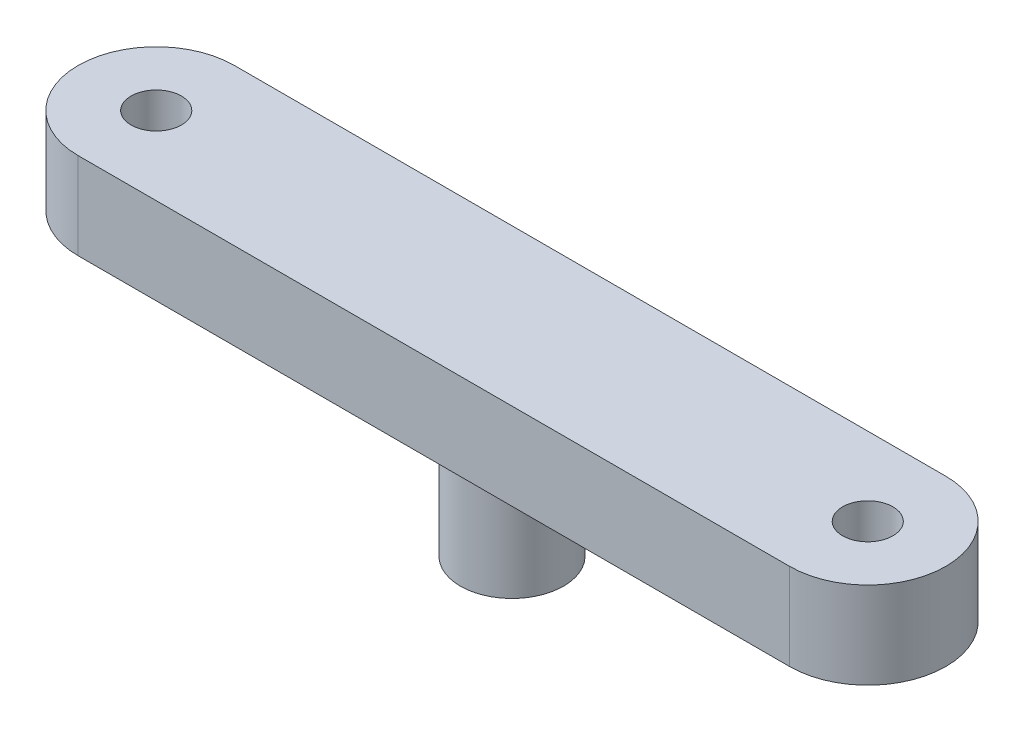
ISO-10303-21;
HEADER;
FILE_DESCRIPTION(('STEP AP214'),'2;1');
FILE_NAME('part.step','',(''),(''),'','','');
FILE_SCHEMA(('AUTOMOTIVE_DESIGN { 1 0 10303 214 1 1 1 1 }'));
ENDSEC;
DATA;
#1=APPLICATION_CONTEXT('core data for automotive mechanical design processes');
#2=APPLICATION_PROTOCOL_DEFINITION('international standard','automotive_design',2000,#1);
#3=PRODUCT_CONTEXT('',#1,'mechanical');
#4=PRODUCT('Part','Part','',(#3));
#5=PRODUCT_RELATED_PRODUCT_CATEGORY('part','',(#4));
#6=PRODUCT_DEFINITION_FORMATION('','',#4);
#7=PRODUCT_DEFINITION_CONTEXT('part definition',#1,'design');
#8=PRODUCT_DEFINITION('design','',#6,#7);
#9=PRODUCT_DEFINITION_SHAPE('','',#8);
#10=(LENGTH_UNIT() NAMED_UNIT(*) SI_UNIT(.MILLI.,.METRE.));
#11=(NAMED_UNIT(*) PLANE_ANGLE_UNIT() SI_UNIT($,.RADIAN.));
#12=(NAMED_UNIT(*) SI_UNIT($,.STERADIAN.) SOLID_ANGLE_UNIT());
#13=UNCERTAINTY_MEASURE_WITH_UNIT(LENGTH_MEASURE(1.E-05),#10,'distance_accuracy_value','');
#14=(GEOMETRIC_REPRESENTATION_CONTEXT(3) GLOBAL_UNCERTAINTY_ASSIGNED_CONTEXT((#13)) GLOBAL_UNIT_ASSIGNED_CONTEXT((#10,
#11,#12)) REPRESENTATION_CONTEXT('',''));
#15=CARTESIAN_POINT('',(0.,0.,0.));
#16=DIRECTION('',(0.,0.,1.));
#17=DIRECTION('',(1.,0.,0.));
#18=AXIS2_PLACEMENT_3D('',#15,#16,#17);
#19=CARTESIAN_POINT('',(-20.5,-27.5,485.5));
#20=DIRECTION('',(0.,0.,1.));
#21=DIRECTION('',(1.,0.,0.));
#22=AXIS2_PLACEMENT_3D('',#19,#20,#21);
#23=PLANE('',#22);
#24=DIRECTION('',(-1.,0.,0.));
#25=VECTOR('',#24,1.);
#26=CARTESIAN_POINT('',(-20.5,-32.5,485.5));
#27=LINE('',#26,#25);
#28=CARTESIAN_POINT('',(20.5,-32.5,485.5));
#29=VERTEX_POINT('',#28);
#30=CARTESIAN_POINT('',(-20.5,-32.5,485.5));
#31=VERTEX_POINT('',#30);
#32=EDGE_CURVE('E69',#29,#31,#27,.T.);
#33=ORIENTED_EDGE('',*,*,#32,.T.);
#34=DIRECTION('',(0.,-1.,0.));
#35=VECTOR('',#34,1.);
#36=CARTESIAN_POINT('',(-20.5,-27.5,485.5));
#37=LINE('',#36,#35);
#38=CARTESIAN_POINT('',(-20.5,-27.5,485.5));
#39=VERTEX_POINT('',#38);
#40=EDGE_CURVE('E48',#39,#31,#37,.T.);
#41=ORIENTED_EDGE('',*,*,#40,.F.);
#42=DIRECTION('',(-1.,0.,0.));
#43=VECTOR('',#42,1.);
#44=CARTESIAN_POINT('',(-20.5,-27.5,485.5));
#45=LINE('',#44,#43);
#46=CARTESIAN_POINT('',(20.5,-27.5,485.5));
#47=VERTEX_POINT('',#46);
#48=EDGE_CURVE('E94',#47,#39,#45,.T.);
#49=ORIENTED_EDGE('',*,*,#48,.F.);
#50=DIRECTION('',(0.,-1.,0.));
#51=VECTOR('',#50,1.);
#52=CARTESIAN_POINT('',(20.5,-27.5,485.5));
#53=LINE('',#52,#51);
#54=EDGE_CURVE('E11',#47,#29,#53,.T.);
#55=ORIENTED_EDGE('',*,*,#54,.T.);
#56=EDGE_LOOP('',(#33,#41,#49,#55));
#57=FACE_BOUND('',#56,.T.);
#58=ADVANCED_FACE('F39',(#57),#23,.F.);
#59=CARTESIAN_POINT('',(-20.5,-27.5,494.5));
#60=DIRECTION('',(0.,0.,-1.));
#61=DIRECTION('',(-1.,0.,0.));
#62=AXIS2_PLACEMENT_3D('',#59,#60,#61);
#63=PLANE('',#62);
#64=DIRECTION('',(1.,0.,0.));
#65=VECTOR('',#64,1.);
#66=CARTESIAN_POINT('',(-20.5,-32.5,494.5));
#67=LINE('',#66,#65);
#68=CARTESIAN_POINT('',(-20.5,-32.5,494.5));
#69=VERTEX_POINT('',#68);
#70=CARTESIAN_POINT('',(20.5,-32.5,494.5));
#71=VERTEX_POINT('',#70);
#72=EDGE_CURVE('E87',#69,#71,#67,.T.);
#73=ORIENTED_EDGE('',*,*,#72,.T.);
#74=DIRECTION('',(0.,-1.,0.));
#75=VECTOR('',#74,1.);
#76=CARTESIAN_POINT('',(20.5,-27.5,494.5));
#77=LINE('',#76,#75);
#78=CARTESIAN_POINT('',(20.5,-27.5,494.5));
#79=VERTEX_POINT('',#78);
#80=EDGE_CURVE('E89',#79,#71,#77,.T.);
#81=ORIENTED_EDGE('',*,*,#80,.F.);
#82=DIRECTION('',(1.,0.,0.));
#83=VECTOR('',#82,1.);
#84=CARTESIAN_POINT('',(-20.5,-27.5,494.5));
#85=LINE('',#84,#83);
#86=CARTESIAN_POINT('',(-20.5,-27.5,494.5));
#87=VERTEX_POINT('',#86);
#88=EDGE_CURVE('E60',#87,#79,#85,.T.);
#89=ORIENTED_EDGE('',*,*,#88,.F.);
#90=DIRECTION('',(0.,-1.,0.));
#91=VECTOR('',#90,1.);
#92=CARTESIAN_POINT('',(-20.5,-27.5,494.5));
#93=LINE('',#92,#91);
#94=EDGE_CURVE('E93',#87,#69,#93,.T.);
#95=ORIENTED_EDGE('',*,*,#94,.T.);
#96=EDGE_LOOP('',(#73,#81,#89,#95));
#97=FACE_BOUND('',#96,.T.);
#98=ADVANCED_FACE('F88',(#97),#63,.F.);
#99=CARTESIAN_POINT('',(0.,-27.5,0.));
#100=DIRECTION('',(0.,-1.,0.));
#101=DIRECTION('',(0.,0.,-1.));
#102=AXIS2_PLACEMENT_3D('',#99,#100,#101);
#103=PLANE('',#102);
#104=CARTESIAN_POINT('',(-20.5,-27.5,490.));
#105=DIRECTION('',(0.,1.,0.));
#106=DIRECTION('',(0.,0.,1.));
#107=AXIS2_PLACEMENT_3D('',#104,#105,#106);
#108=CIRCLE('',#107,1.45);
#109=CARTESIAN_POINT('',(-20.5,-27.5,491.45));
#110=VERTEX_POINT('',#109);
#111=EDGE_CURVE('E138',#110,#110,#108,.T.);
#112=ORIENTED_EDGE('',*,*,#111,.F.);
#113=EDGE_LOOP('',(#112));
#114=FACE_BOUND('',#113,.T.);
#115=CARTESIAN_POINT('',(20.5,-27.5,490.));
#116=DIRECTION('',(0.,1.,0.));
#117=DIRECTION('',(0.,0.,1.));
#118=AXIS2_PLACEMENT_3D('',#115,#116,#117);
#119=CIRCLE('',#118,1.45);
#120=CARTESIAN_POINT('',(20.5,-27.5,491.45));
#121=VERTEX_POINT('',#120);
#122=EDGE_CURVE('E122',#121,#121,#119,.T.);
#123=ORIENTED_EDGE('',*,*,#122,.F.);
#124=EDGE_LOOP('',(#123));
#125=FACE_BOUND('',#124,.T.);
#126=ORIENTED_EDGE('',*,*,#48,.T.);
#127=CARTESIAN_POINT('',(-20.5,-27.5,490.));
#128=DIRECTION('',(0.,1.,0.));
#129=DIRECTION('',(0.,0.,1.));
#130=AXIS2_PLACEMENT_3D('',#127,#128,#129);
#131=CIRCLE('',#130,4.5);
#132=EDGE_CURVE('E104',#39,#87,#131,.T.);
#133=ORIENTED_EDGE('',*,*,#132,.T.);
#134=ORIENTED_EDGE('',*,*,#88,.T.);
#135=CARTESIAN_POINT('',(20.5,-27.5,490.));
#136=DIRECTION('',(0.,1.,0.));
#137=DIRECTION('',(0.,0.,1.));
#138=AXIS2_PLACEMENT_3D('',#135,#136,#137);
#139=CIRCLE('',#138,4.5);
#140=EDGE_CURVE('E100',#79,#47,#139,.T.);
#141=ORIENTED_EDGE('',*,*,#140,.T.);
#142=EDGE_LOOP('',(#126,#133,#134,#141));
#143=FACE_BOUND('',#142,.T.);
#144=ADVANCED_FACE('F143',(#114,#125,#143),#103,.F.);
#145=CARTESIAN_POINT('',(0.,-32.5,0.));
#146=DIRECTION('',(0.,-1.,0.));
#147=DIRECTION('',(0.,0.,-1.));
#148=AXIS2_PLACEMENT_3D('',#145,#146,#147);
#149=PLANE('',#148);
#150=CARTESIAN_POINT('',(-20.5,-32.5,490.));
#151=DIRECTION('',(0.,1.,0.));
#152=DIRECTION('',(0.,0.,1.));
#153=AXIS2_PLACEMENT_3D('',#150,#151,#152);
#154=CIRCLE('',#153,2.5);
#155=CARTESIAN_POINT('',(-20.5,-32.5,492.5));
#156=VERTEX_POINT('',#155);
#157=EDGE_CURVE('E124',#156,#156,#154,.T.);
#158=ORIENTED_EDGE('',*,*,#157,.T.);
#159=EDGE_LOOP('',(#158));
#160=FACE_BOUND('',#159,.T.);
#161=CARTESIAN_POINT('',(20.5,-32.5,490.));
#162=DIRECTION('',(0.,1.,0.));
#163=DIRECTION('',(0.,0.,1.));
#164=AXIS2_PLACEMENT_3D('',#161,#162,#163);
#165=CIRCLE('',#164,2.5);
#166=CARTESIAN_POINT('',(20.5,-32.5,492.5));
#167=VERTEX_POINT('',#166);
#168=EDGE_CURVE('E127',#167,#167,#165,.T.);
#169=ORIENTED_EDGE('',*,*,#168,.T.);
#170=EDGE_LOOP('',(#169));
#171=FACE_BOUND('',#170,.T.);
#172=CARTESIAN_POINT('',(0.,-32.5,490.));
#173=DIRECTION('',(0.,1.,0.));
#174=DIRECTION('',(0.,0.,1.));
#175=AXIS2_PLACEMENT_3D('',#172,#173,#174);
#176=CIRCLE('',#175,2.975);
#177=CARTESIAN_POINT('',(0.,-32.5,492.975));
#178=VERTEX_POINT('',#177);
#179=EDGE_CURVE('E106',#178,#178,#176,.T.);
#180=ORIENTED_EDGE('',*,*,#179,.T.);
#181=EDGE_LOOP('',(#180));
#182=FACE_BOUND('',#181,.T.);
#183=ORIENTED_EDGE('',*,*,#72,.F.);
#184=CARTESIAN_POINT('',(-20.5,-32.5,490.));
#185=DIRECTION('',(0.,1.,0.));
#186=DIRECTION('',(0.,0.,1.));
#187=AXIS2_PLACEMENT_3D('',#184,#185,#186);
#188=CIRCLE('',#187,4.5);
#189=EDGE_CURVE('E105',#31,#69,#188,.T.);
#190=ORIENTED_EDGE('',*,*,#189,.F.);
#191=ORIENTED_EDGE('',*,*,#32,.F.);
#192=CARTESIAN_POINT('',(20.5,-32.5,490.));
#193=DIRECTION('',(0.,1.,0.));
#194=DIRECTION('',(0.,0.,1.));
#195=AXIS2_PLACEMENT_3D('',#192,#193,#194);
#196=CIRCLE('',#195,4.5);
#197=EDGE_CURVE('E96',#71,#29,#196,.T.);
#198=ORIENTED_EDGE('',*,*,#197,.F.);
#199=EDGE_LOOP('',(#183,#190,#191,#198));
#200=FACE_BOUND('',#199,.T.);
#201=ADVANCED_FACE('F103',(#160,#171,#182,#200),#149,.T.);
#202=CARTESIAN_POINT('',(20.5,-27.5,490.));
#203=DIRECTION('',(0.,-1.,0.));
#204=DIRECTION('',(0.,0.,-1.));
#205=AXIS2_PLACEMENT_3D('',#202,#203,#204);
#206=CYLINDRICAL_SURFACE('',#205,4.5);
#207=ORIENTED_EDGE('',*,*,#197,.T.);
#208=ORIENTED_EDGE('',*,*,#54,.F.);
#209=ORIENTED_EDGE('',*,*,#140,.F.);
#210=ORIENTED_EDGE('',*,*,#80,.T.);
#211=EDGE_LOOP('',(#207,#208,#209,#210));
#212=FACE_BOUND('',#211,.T.);
#213=ADVANCED_FACE('F98',(#212),#206,.T.);
#214=CARTESIAN_POINT('',(-20.5,-27.5,490.));
#215=DIRECTION('',(0.,-1.,0.));
#216=DIRECTION('',(0.,0.,-1.));
#217=AXIS2_PLACEMENT_3D('',#214,#215,#216);
#218=CYLINDRICAL_SURFACE('',#217,4.5);
#219=ORIENTED_EDGE('',*,*,#132,.F.);
#220=ORIENTED_EDGE('',*,*,#40,.T.);
#221=ORIENTED_EDGE('',*,*,#189,.T.);
#222=ORIENTED_EDGE('',*,*,#94,.F.);
#223=EDGE_LOOP('',(#219,#220,#221,#222));
#224=FACE_BOUND('',#223,.T.);
#225=ADVANCED_FACE('F146',(#224),#218,.T.);
#226=CARTESIAN_POINT('',(0.,-32.5,490.));
#227=DIRECTION('',(0.,-1.,0.));
#228=DIRECTION('',(0.,0.,-1.));
#229=AXIS2_PLACEMENT_3D('',#226,#227,#228);
#230=CYLINDRICAL_SURFACE('',#229,2.975);
#231=ORIENTED_EDGE('',*,*,#179,.F.);
#232=EDGE_LOOP('',(#231));
#233=FACE_BOUND('',#232,.T.);
#234=CARTESIAN_POINT('',(0.,-39.5,490.));
#235=DIRECTION('',(0.,1.,0.));
#236=DIRECTION('',(0.,0.,1.));
#237=AXIS2_PLACEMENT_3D('',#234,#235,#236);
#238=CIRCLE('',#237,2.975);
#239=CARTESIAN_POINT('',(0.,-39.5,492.975));
#240=VERTEX_POINT('',#239);
#241=EDGE_CURVE('E140',#240,#240,#238,.T.);
#242=ORIENTED_EDGE('',*,*,#241,.T.);
#243=EDGE_LOOP('',(#242));
#244=FACE_BOUND('',#243,.T.);
#245=ADVANCED_FACE('F164',(#233,#244),#230,.T.);
#246=CARTESIAN_POINT('',(0.,-39.5,490.));
#247=DIRECTION('',(0.,1.,0.));
#248=DIRECTION('',(0.,0.,1.));
#249=AXIS2_PLACEMENT_3D('',#246,#247,#248);
#250=PLANE('',#249);
#251=ORIENTED_EDGE('',*,*,#241,.F.);
#252=EDGE_LOOP('',(#251));
#253=FACE_BOUND('',#252,.T.);
#254=ADVANCED_FACE('F166',(#253),#250,.F.);
#255=CARTESIAN_POINT('',(20.5,-27.5,490.));
#256=DIRECTION('',(0.,-1.,0.));
#257=DIRECTION('',(0.,0.,-1.));
#258=AXIS2_PLACEMENT_3D('',#255,#256,#257);
#259=CYLINDRICAL_SURFACE('',#258,1.45);
#260=CARTESIAN_POINT('',(20.5,-29.8,490.));
#261=DIRECTION('',(0.,1.,0.));
#262=DIRECTION('',(0.,0.,1.));
#263=AXIS2_PLACEMENT_3D('',#260,#261,#262);
#264=CIRCLE('',#263,1.45);
#265=CARTESIAN_POINT('',(20.5,-29.8,491.45));
#266=VERTEX_POINT('',#265);
#267=EDGE_CURVE('E45',#266,#266,#264,.T.);
#268=ORIENTED_EDGE('',*,*,#267,.F.);
#269=EDGE_LOOP('',(#268));
#270=FACE_BOUND('',#269,.T.);
#271=ORIENTED_EDGE('',*,*,#122,.T.);
#272=EDGE_LOOP('',(#271));
#273=FACE_BOUND('',#272,.T.);
#274=ADVANCED_FACE('F175',(#270,#273),#259,.F.);
#275=CARTESIAN_POINT('',(-20.5,-27.5,490.));
#276=DIRECTION('',(0.,-1.,0.));
#277=DIRECTION('',(0.,0.,-1.));
#278=AXIS2_PLACEMENT_3D('',#275,#276,#277);
#279=CYLINDRICAL_SURFACE('',#278,1.45);
#280=CARTESIAN_POINT('',(-20.5,-29.8,490.));
#281=DIRECTION('',(0.,1.,0.));
#282=DIRECTION('',(0.,0.,1.));
#283=AXIS2_PLACEMENT_3D('',#280,#281,#282);
#284=CIRCLE('',#283,1.45);
#285=CARTESIAN_POINT('',(-20.5,-29.8,491.45));
#286=VERTEX_POINT('',#285);
#287=EDGE_CURVE('E114',#286,#286,#284,.T.);
#288=ORIENTED_EDGE('',*,*,#287,.F.);
#289=EDGE_LOOP('',(#288));
#290=FACE_BOUND('',#289,.T.);
#291=ORIENTED_EDGE('',*,*,#111,.T.);
#292=EDGE_LOOP('',(#291));
#293=FACE_BOUND('',#292,.T.);
#294=ADVANCED_FACE('F176',(#290,#293),#279,.F.);
#295=CARTESIAN_POINT('',(-20.5,-29.8,490.));
#296=DIRECTION('',(0.,-1.,0.));
#297=DIRECTION('',(0.,0.,-1.));
#298=AXIS2_PLACEMENT_3D('',#295,#296,#297);
#299=CYLINDRICAL_SURFACE('',#298,2.5);
#300=CARTESIAN_POINT('',(-20.5,-29.8,490.));
#301=DIRECTION('',(0.,1.,0.));
#302=DIRECTION('',(0.,0.,1.));
#303=AXIS2_PLACEMENT_3D('',#300,#301,#302);
#304=CIRCLE('',#303,2.5);
#305=CARTESIAN_POINT('',(-20.5,-29.8,492.5));
#306=VERTEX_POINT('',#305);
#307=EDGE_CURVE('E120',#306,#306,#304,.T.);
#308=ORIENTED_EDGE('',*,*,#307,.T.);
#309=EDGE_LOOP('',(#308));
#310=FACE_BOUND('',#309,.T.);
#311=ORIENTED_EDGE('',*,*,#157,.F.);
#312=EDGE_LOOP('',(#311));
#313=FACE_BOUND('',#312,.T.);
#314=ADVANCED_FACE('F179',(#310,#313),#299,.F.);
#315=CARTESIAN_POINT('',(-20.5,-29.8,490.));
#316=DIRECTION('',(0.,1.,0.));
#317=DIRECTION('',(0.,0.,1.));
#318=AXIS2_PLACEMENT_3D('',#315,#316,#317);
#319=PLANE('',#318);
#320=ORIENTED_EDGE('',*,*,#287,.T.);
#321=EDGE_LOOP('',(#320));
#322=FACE_BOUND('',#321,.T.);
#323=ORIENTED_EDGE('',*,*,#307,.F.);
#324=EDGE_LOOP('',(#323));
#325=FACE_BOUND('',#324,.T.);
#326=ADVANCED_FACE('F186',(#322,#325),#319,.F.);
#327=CARTESIAN_POINT('',(20.5,-29.8,490.));
#328=DIRECTION('',(0.,-1.,0.));
#329=DIRECTION('',(0.,0.,-1.));
#330=AXIS2_PLACEMENT_3D('',#327,#328,#329);
#331=CYLINDRICAL_SURFACE('',#330,2.5);
#332=CARTESIAN_POINT('',(20.5,-29.8,490.));
#333=DIRECTION('',(0.,1.,0.));
#334=DIRECTION('',(0.,0.,1.));
#335=AXIS2_PLACEMENT_3D('',#332,#333,#334);
#336=CIRCLE('',#335,2.5);
#337=CARTESIAN_POINT('',(20.5,-29.8,492.5));
#338=VERTEX_POINT('',#337);
#339=EDGE_CURVE('E133',#338,#338,#336,.T.);
#340=ORIENTED_EDGE('',*,*,#339,.T.);
#341=EDGE_LOOP('',(#340));
#342=FACE_BOUND('',#341,.T.);
#343=ORIENTED_EDGE('',*,*,#168,.F.);
#344=EDGE_LOOP('',(#343));
#345=FACE_BOUND('',#344,.T.);
#346=ADVANCED_FACE('F184',(#342,#345),#331,.F.);
#347=CARTESIAN_POINT('',(20.5,-29.8,490.));
#348=DIRECTION('',(0.,1.,0.));
#349=DIRECTION('',(0.,0.,1.));
#350=AXIS2_PLACEMENT_3D('',#347,#348,#349);
#351=PLANE('',#350);
#352=ORIENTED_EDGE('',*,*,#267,.T.);
#353=EDGE_LOOP('',(#352));
#354=FACE_BOUND('',#353,.T.);
#355=ORIENTED_EDGE('',*,*,#339,.F.);
#356=EDGE_LOOP('',(#355));
#357=FACE_BOUND('',#356,.T.);
#358=ADVANCED_FACE('F185',(#354,#357),#351,.F.);
#359=CLOSED_SHELL('',(#58,#98,#144,#201,#213,#225,#245,#254,#274,#294,#314,#326,#346,#358));
#360=MANIFOLD_SOLID_BREP('B2',#359);
#361=ADVANCED_BREP_SHAPE_REPRESENTATION('',(#18,#360),#14);
#362=SHAPE_DEFINITION_REPRESENTATION(#9,#361);
ENDSEC;
END-ISO-10303-21;
